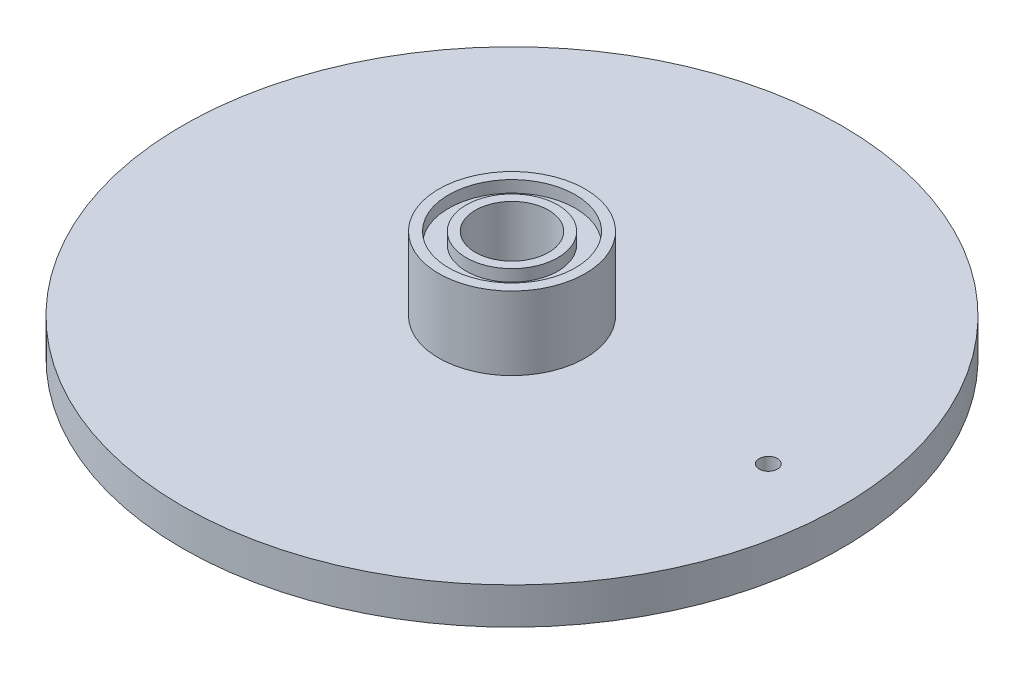
ISO-10303-21;
HEADER;
FILE_DESCRIPTION(('STEP AP214'),'2;1');
FILE_NAME('part.step','',(''),(''),'','','');
FILE_SCHEMA(('AUTOMOTIVE_DESIGN { 1 0 10303 214 1 1 1 1 }'));
ENDSEC;
DATA;
#1=APPLICATION_CONTEXT('core data for automotive mechanical design processes');
#2=APPLICATION_PROTOCOL_DEFINITION('international standard','automotive_design',2000,#1);
#3=PRODUCT_CONTEXT('',#1,'mechanical');
#4=PRODUCT('Part','Part','',(#3));
#5=PRODUCT_RELATED_PRODUCT_CATEGORY('part','',(#4));
#6=PRODUCT_DEFINITION_FORMATION('','',#4);
#7=PRODUCT_DEFINITION_CONTEXT('part definition',#1,'design');
#8=PRODUCT_DEFINITION('design','',#6,#7);
#9=PRODUCT_DEFINITION_SHAPE('','',#8);
#10=(LENGTH_UNIT() NAMED_UNIT(*) SI_UNIT(.MILLI.,.METRE.));
#11=(NAMED_UNIT(*) PLANE_ANGLE_UNIT() SI_UNIT($,.RADIAN.));
#12=(NAMED_UNIT(*) SI_UNIT($,.STERADIAN.) SOLID_ANGLE_UNIT());
#13=UNCERTAINTY_MEASURE_WITH_UNIT(LENGTH_MEASURE(1.E-05),#10,'distance_accuracy_value','');
#14=(GEOMETRIC_REPRESENTATION_CONTEXT(3) GLOBAL_UNCERTAINTY_ASSIGNED_CONTEXT((#13)) GLOBAL_UNIT_ASSIGNED_CONTEXT((#10,
#11,#12)) REPRESENTATION_CONTEXT('',''));
#15=CARTESIAN_POINT('',(0.,0.,0.));
#16=DIRECTION('',(0.,0.,1.));
#17=DIRECTION('',(1.,0.,0.));
#18=AXIS2_PLACEMENT_3D('',#15,#16,#17);
#19=CARTESIAN_POINT('',(0.,0.,0.));
#20=DIRECTION('',(0.,-1.,0.));
#21=DIRECTION('',(0.,0.,-1.));
#22=AXIS2_PLACEMENT_3D('',#19,#20,#21);
#23=CYLINDRICAL_SURFACE('',#22,6.35);
#24=CARTESIAN_POINT('',(0.,6.35,0.));
#25=DIRECTION('',(0.,-1.,0.));
#26=DIRECTION('',(0.,0.,-1.));
#27=AXIS2_PLACEMENT_3D('',#24,#25,#26);
#28=CIRCLE('',#27,6.35);
#29=CARTESIAN_POINT('',(0.,6.35,-6.35));
#30=VERTEX_POINT('',#29);
#31=EDGE_CURVE('E11',#30,#30,#28,.T.);
#32=ORIENTED_EDGE('',*,*,#31,.F.);
#33=EDGE_LOOP('',(#32));
#34=FACE_BOUND('',#33,.T.);
#35=CARTESIAN_POINT('',(0.,0.,0.));
#36=DIRECTION('',(0.,-1.,0.));
#37=DIRECTION('',(0.,0.,-1.));
#38=AXIS2_PLACEMENT_3D('',#35,#36,#37);
#39=CIRCLE('',#38,6.35);
#40=CARTESIAN_POINT('',(0.,0.,-6.35));
#41=VERTEX_POINT('',#40);
#42=EDGE_CURVE('E59',#41,#41,#39,.T.);
#43=ORIENTED_EDGE('',*,*,#42,.T.);
#44=EDGE_LOOP('',(#43));
#45=FACE_BOUND('',#44,.T.);
#46=ADVANCED_FACE('F38',(#34,#45),#23,.F.);
#47=CARTESIAN_POINT('',(-6.35,6.35,0.));
#48=DIRECTION('',(0.,-1.,0.));
#49=DIRECTION('',(0.,0.,-1.));
#50=AXIS2_PLACEMENT_3D('',#47,#48,#49);
#51=PLANE('',#50);
#52=CARTESIAN_POINT('',(0.,6.35,0.));
#53=DIRECTION('',(0.,-1.,0.));
#54=DIRECTION('',(0.,0.,-1.));
#55=AXIS2_PLACEMENT_3D('',#52,#53,#54);
#56=CIRCLE('',#55,8.382);
#57=CARTESIAN_POINT('',(0.,6.35,-8.382));
#58=VERTEX_POINT('',#57);
#59=EDGE_CURVE('E45',#58,#58,#56,.T.);
#60=ORIENTED_EDGE('',*,*,#59,.F.);
#61=EDGE_LOOP('',(#60));
#62=FACE_BOUND('',#61,.T.);
#63=ORIENTED_EDGE('',*,*,#31,.T.);
#64=EDGE_LOOP('',(#63));
#65=FACE_BOUND('',#64,.T.);
#66=ADVANCED_FACE('F134',(#62,#65),#51,.F.);
#67=CARTESIAN_POINT('',(0.,0.,0.));
#68=DIRECTION('',(0.,-1.,0.));
#69=DIRECTION('',(0.,0.,-1.));
#70=AXIS2_PLACEMENT_3D('',#67,#68,#69);
#71=CYLINDRICAL_SURFACE('',#70,8.382);
#72=CARTESIAN_POINT('',(0.,9.398,0.));
#73=DIRECTION('',(0.,-1.,0.));
#74=DIRECTION('',(0.,0.,-1.));
#75=AXIS2_PLACEMENT_3D('',#72,#73,#74);
#76=CIRCLE('',#75,8.382);
#77=CARTESIAN_POINT('',(0.,9.398,-8.382));
#78=VERTEX_POINT('',#77);
#79=EDGE_CURVE('E125',#78,#78,#76,.T.);
#80=ORIENTED_EDGE('',*,*,#79,.F.);
#81=EDGE_LOOP('',(#80));
#82=FACE_BOUND('',#81,.T.);
#83=ORIENTED_EDGE('',*,*,#59,.T.);
#84=EDGE_LOOP('',(#83));
#85=FACE_BOUND('',#84,.T.);
#86=ADVANCED_FACE('F132',(#82,#85),#71,.F.);
#87=CARTESIAN_POINT('',(-8.382,9.398,0.));
#88=DIRECTION('',(0.,1.,0.));
#89=DIRECTION('',(0.,0.,1.));
#90=AXIS2_PLACEMENT_3D('',#87,#88,#89);
#91=PLANE('',#90);
#92=CARTESIAN_POINT('',(0.,9.398,0.));
#93=DIRECTION('',(0.,-1.,0.));
#94=DIRECTION('',(0.,0.,-1.));
#95=AXIS2_PLACEMENT_3D('',#92,#93,#94);
#96=CIRCLE('',#95,6.35);
#97=CARTESIAN_POINT('',(0.,9.398,-6.35));
#98=VERTEX_POINT('',#97);
#99=EDGE_CURVE('E121',#98,#98,#96,.T.);
#100=ORIENTED_EDGE('',*,*,#99,.F.);
#101=EDGE_LOOP('',(#100));
#102=FACE_BOUND('',#101,.T.);
#103=ORIENTED_EDGE('',*,*,#79,.T.);
#104=EDGE_LOOP('',(#103));
#105=FACE_BOUND('',#104,.T.);
#106=ADVANCED_FACE('F224',(#102,#105),#91,.F.);
#107=CARTESIAN_POINT('',(0.,0.,0.));
#108=DIRECTION('',(0.,-1.,0.));
#109=DIRECTION('',(0.,0.,-1.));
#110=AXIS2_PLACEMENT_3D('',#107,#108,#109);
#111=CYLINDRICAL_SURFACE('',#110,6.35);
#112=CARTESIAN_POINT('',(0.,19.05,0.));
#113=DIRECTION('',(0.,-1.,0.));
#114=DIRECTION('',(0.,0.,-1.));
#115=AXIS2_PLACEMENT_3D('',#112,#113,#114);
#116=CIRCLE('',#115,6.35);
#117=CARTESIAN_POINT('',(0.,19.05,-6.35));
#118=VERTEX_POINT('',#117);
#119=EDGE_CURVE('E117',#118,#118,#116,.T.);
#120=ORIENTED_EDGE('',*,*,#119,.F.);
#121=EDGE_LOOP('',(#120));
#122=FACE_BOUND('',#121,.T.);
#123=ORIENTED_EDGE('',*,*,#99,.T.);
#124=EDGE_LOOP('',(#123));
#125=FACE_BOUND('',#124,.T.);
#126=ADVANCED_FACE('F218',(#122,#125),#111,.F.);
#127=CARTESIAN_POINT('',(-7.9375,19.05,0.));
#128=DIRECTION('',(0.,-1.,0.));
#129=DIRECTION('',(0.,0.,-1.));
#130=AXIS2_PLACEMENT_3D('',#127,#128,#129);
#131=PLANE('',#130);
#132=CARTESIAN_POINT('',(0.,19.05,0.));
#133=DIRECTION('',(0.,-1.,0.));
#134=DIRECTION('',(0.,0.,-1.));
#135=AXIS2_PLACEMENT_3D('',#132,#133,#134);
#136=CIRCLE('',#135,7.9375);
#137=CARTESIAN_POINT('',(0.,19.05,-7.9375));
#138=VERTEX_POINT('',#137);
#139=EDGE_CURVE('E113',#138,#138,#136,.T.);
#140=ORIENTED_EDGE('',*,*,#139,.F.);
#141=EDGE_LOOP('',(#140));
#142=FACE_BOUND('',#141,.T.);
#143=ORIENTED_EDGE('',*,*,#119,.T.);
#144=EDGE_LOOP('',(#143));
#145=FACE_BOUND('',#144,.T.);
#146=ADVANCED_FACE('F212',(#142,#145),#131,.F.);
#147=CARTESIAN_POINT('',(0.,0.,0.));
#148=DIRECTION('',(0.,-1.,0.));
#149=DIRECTION('',(0.,0.,-1.));
#150=AXIS2_PLACEMENT_3D('',#147,#148,#149);
#151=CYLINDRICAL_SURFACE('',#150,7.9375);
#152=CARTESIAN_POINT('',(0.,17.018,0.));
#153=DIRECTION('',(0.,-1.,0.));
#154=DIRECTION('',(0.,0.,-1.));
#155=AXIS2_PLACEMENT_3D('',#152,#153,#154);
#156=CIRCLE('',#155,7.9375);
#157=CARTESIAN_POINT('',(0.,17.018,-7.9375));
#158=VERTEX_POINT('',#157);
#159=EDGE_CURVE('E109',#158,#158,#156,.T.);
#160=ORIENTED_EDGE('',*,*,#159,.F.);
#161=EDGE_LOOP('',(#160));
#162=FACE_BOUND('',#161,.T.);
#163=ORIENTED_EDGE('',*,*,#139,.T.);
#164=EDGE_LOOP('',(#163));
#165=FACE_BOUND('',#164,.T.);
#166=ADVANCED_FACE('F206',(#162,#165),#151,.T.);
#167=CARTESIAN_POINT('',(-10.9855,17.018,0.));
#168=DIRECTION('',(0.,-1.,0.));
#169=DIRECTION('',(0.,0.,-1.));
#170=AXIS2_PLACEMENT_3D('',#167,#168,#169);
#171=PLANE('',#170);
#172=CARTESIAN_POINT('',(0.,17.018,0.));
#173=DIRECTION('',(0.,-1.,0.));
#174=DIRECTION('',(0.,0.,-1.));
#175=AXIS2_PLACEMENT_3D('',#172,#173,#174);
#176=CIRCLE('',#175,10.9855);
#177=CARTESIAN_POINT('',(0.,17.018,-10.9855));
#178=VERTEX_POINT('',#177);
#179=EDGE_CURVE('E105',#178,#178,#176,.T.);
#180=ORIENTED_EDGE('',*,*,#179,.F.);
#181=EDGE_LOOP('',(#180));
#182=FACE_BOUND('',#181,.T.);
#183=ORIENTED_EDGE('',*,*,#159,.T.);
#184=EDGE_LOOP('',(#183));
#185=FACE_BOUND('',#184,.T.);
#186=ADVANCED_FACE('F200',(#182,#185),#171,.F.);
#187=CARTESIAN_POINT('',(0.,0.,0.));
#188=DIRECTION('',(0.,-1.,0.));
#189=DIRECTION('',(0.,0.,-1.));
#190=AXIS2_PLACEMENT_3D('',#187,#188,#189);
#191=CYLINDRICAL_SURFACE('',#190,10.9855);
#192=CARTESIAN_POINT('',(0.,19.05,0.));
#193=DIRECTION('',(0.,-1.,0.));
#194=DIRECTION('',(0.,0.,-1.));
#195=AXIS2_PLACEMENT_3D('',#192,#193,#194);
#196=CIRCLE('',#195,10.9855);
#197=CARTESIAN_POINT('',(0.,19.05,-10.9855));
#198=VERTEX_POINT('',#197);
#199=EDGE_CURVE('E101',#198,#198,#196,.T.);
#200=ORIENTED_EDGE('',*,*,#199,.F.);
#201=EDGE_LOOP('',(#200));
#202=FACE_BOUND('',#201,.T.);
#203=ORIENTED_EDGE('',*,*,#179,.T.);
#204=EDGE_LOOP('',(#203));
#205=FACE_BOUND('',#204,.T.);
#206=ADVANCED_FACE('F194',(#202,#205),#191,.F.);
#207=CARTESIAN_POINT('',(-12.7,19.05,0.));
#208=DIRECTION('',(0.,-1.,0.));
#209=DIRECTION('',(0.,0.,-1.));
#210=AXIS2_PLACEMENT_3D('',#207,#208,#209);
#211=PLANE('',#210);
#212=CARTESIAN_POINT('',(0.,19.05,0.));
#213=DIRECTION('',(0.,-1.,0.));
#214=DIRECTION('',(0.,0.,-1.));
#215=AXIS2_PLACEMENT_3D('',#212,#213,#214);
#216=CIRCLE('',#215,12.7);
#217=CARTESIAN_POINT('',(0.,19.05,-12.7));
#218=VERTEX_POINT('',#217);
#219=EDGE_CURVE('E97',#218,#218,#216,.T.);
#220=ORIENTED_EDGE('',*,*,#219,.F.);
#221=EDGE_LOOP('',(#220));
#222=FACE_BOUND('',#221,.T.);
#223=ORIENTED_EDGE('',*,*,#199,.T.);
#224=EDGE_LOOP('',(#223));
#225=FACE_BOUND('',#224,.T.);
#226=ADVANCED_FACE('F188',(#222,#225),#211,.F.);
#227=CARTESIAN_POINT('',(0.,0.,0.));
#228=DIRECTION('',(0.,-1.,0.));
#229=DIRECTION('',(0.,0.,-1.));
#230=AXIS2_PLACEMENT_3D('',#227,#228,#229);
#231=CYLINDRICAL_SURFACE('',#230,12.7);
#232=CARTESIAN_POINT('',(0.,6.34999999999999,0.));
#233=DIRECTION('',(0.,-1.,0.));
#234=DIRECTION('',(0.,0.,-1.));
#235=AXIS2_PLACEMENT_3D('',#232,#233,#234);
#236=CIRCLE('',#235,12.7);
#237=CARTESIAN_POINT('',(0.,6.34999999999999,-12.7));
#238=VERTEX_POINT('',#237);
#239=EDGE_CURVE('E93',#238,#238,#236,.T.);
#240=ORIENTED_EDGE('',*,*,#239,.F.);
#241=EDGE_LOOP('',(#240));
#242=FACE_BOUND('',#241,.T.);
#243=ORIENTED_EDGE('',*,*,#219,.T.);
#244=EDGE_LOOP('',(#243));
#245=FACE_BOUND('',#244,.T.);
#246=ADVANCED_FACE('F181',(#242,#245),#231,.T.);
#247=CARTESIAN_POINT('',(-57.15,6.34999999999999,0.));
#248=DIRECTION('',(0.,-1.,0.));
#249=DIRECTION('',(0.,0.,-1.));
#250=AXIS2_PLACEMENT_3D('',#247,#248,#249);
#251=PLANE('',#250);
#252=CARTESIAN_POINT('',(44.45,6.35,0.));
#253=DIRECTION('',(0.,1.,0.));
#254=DIRECTION('',(0.,0.,1.));
#255=AXIS2_PLACEMENT_3D('',#252,#253,#254);
#256=CIRCLE('',#255,1.58749999999999);
#257=CARTESIAN_POINT('',(44.45,6.35,1.58749999999999));
#258=VERTEX_POINT('',#257);
#259=EDGE_CURVE('E60',#258,#258,#256,.T.);
#260=ORIENTED_EDGE('',*,*,#259,.F.);
#261=EDGE_LOOP('',(#260));
#262=FACE_BOUND('',#261,.T.);
#263=CARTESIAN_POINT('',(0.,6.34999999999999,0.));
#264=DIRECTION('',(0.,-1.,0.));
#265=DIRECTION('',(0.,0.,-1.));
#266=AXIS2_PLACEMENT_3D('',#263,#264,#265);
#267=CIRCLE('',#266,57.15);
#268=CARTESIAN_POINT('',(0.,6.34999999999999,-57.15));
#269=VERTEX_POINT('',#268);
#270=EDGE_CURVE('E89',#269,#269,#267,.T.);
#271=ORIENTED_EDGE('',*,*,#270,.F.);
#272=EDGE_LOOP('',(#271));
#273=FACE_BOUND('',#272,.T.);
#274=ORIENTED_EDGE('',*,*,#239,.T.);
#275=EDGE_LOOP('',(#274));
#276=FACE_BOUND('',#275,.T.);
#277=ADVANCED_FACE('F175',(#262,#273,#276),#251,.F.);
#278=CARTESIAN_POINT('',(0.,0.,0.));
#279=DIRECTION('',(0.,-1.,0.));
#280=DIRECTION('',(0.,0.,-1.));
#281=AXIS2_PLACEMENT_3D('',#278,#279,#280);
#282=CYLINDRICAL_SURFACE('',#281,57.15);
#283=CARTESIAN_POINT('',(0.,0.,0.));
#284=DIRECTION('',(0.,-1.,0.));
#285=DIRECTION('',(0.,0.,-1.));
#286=AXIS2_PLACEMENT_3D('',#283,#284,#285);
#287=CIRCLE('',#286,57.15);
#288=CARTESIAN_POINT('',(0.,0.,-57.15));
#289=VERTEX_POINT('',#288);
#290=EDGE_CURVE('E85',#289,#289,#287,.T.);
#291=ORIENTED_EDGE('',*,*,#290,.F.);
#292=EDGE_LOOP('',(#291));
#293=FACE_BOUND('',#292,.T.);
#294=ORIENTED_EDGE('',*,*,#270,.T.);
#295=EDGE_LOOP('',(#294));
#296=FACE_BOUND('',#295,.T.);
#297=ADVANCED_FACE('F169',(#293,#296),#282,.T.);
#298=CARTESIAN_POINT('',(-57.15,0.,0.));
#299=DIRECTION('',(0.,1.,0.));
#300=DIRECTION('',(0.,0.,1.));
#301=AXIS2_PLACEMENT_3D('',#298,#299,#300);
#302=PLANE('',#301);
#303=CARTESIAN_POINT('',(0.,0.,0.));
#304=DIRECTION('',(0.,-1.,0.));
#305=DIRECTION('',(0.,0.,-1.));
#306=AXIS2_PLACEMENT_3D('',#303,#304,#305);
#307=CIRCLE('',#306,55.5625);
#308=CARTESIAN_POINT('',(0.,0.,-55.5625));
#309=VERTEX_POINT('',#308);
#310=EDGE_CURVE('E81',#309,#309,#307,.T.);
#311=ORIENTED_EDGE('',*,*,#310,.F.);
#312=EDGE_LOOP('',(#311));
#313=FACE_BOUND('',#312,.T.);
#314=ORIENTED_EDGE('',*,*,#290,.T.);
#315=EDGE_LOOP('',(#314));
#316=FACE_BOUND('',#315,.T.);
#317=ADVANCED_FACE('F163',(#313,#316),#302,.F.);
#318=CARTESIAN_POINT('',(0.,0.,0.));
#319=DIRECTION('',(0.,-1.,0.));
#320=DIRECTION('',(0.,0.,-1.));
#321=AXIS2_PLACEMENT_3D('',#318,#319,#320);
#322=CYLINDRICAL_SURFACE('',#321,55.5625);
#323=CARTESIAN_POINT('',(0.,2.03199999999999,0.));
#324=DIRECTION('',(0.,-1.,0.));
#325=DIRECTION('',(0.,0.,-1.));
#326=AXIS2_PLACEMENT_3D('',#323,#324,#325);
#327=CIRCLE('',#326,55.5625);
#328=CARTESIAN_POINT('',(0.,2.03199999999999,-55.5625));
#329=VERTEX_POINT('',#328);
#330=EDGE_CURVE('E77',#329,#329,#327,.T.);
#331=ORIENTED_EDGE('',*,*,#330,.F.);
#332=EDGE_LOOP('',(#331));
#333=FACE_BOUND('',#332,.T.);
#334=ORIENTED_EDGE('',*,*,#310,.T.);
#335=EDGE_LOOP('',(#334));
#336=FACE_BOUND('',#335,.T.);
#337=ADVANCED_FACE('F157',(#333,#336),#322,.F.);
#338=CARTESIAN_POINT('',(-55.5625,2.03199999999999,0.));
#339=DIRECTION('',(0.,1.,0.));
#340=DIRECTION('',(0.,0.,1.));
#341=AXIS2_PLACEMENT_3D('',#338,#339,#340);
#342=PLANE('',#341);
#343=CARTESIAN_POINT('',(0.,2.03199999999999,0.));
#344=DIRECTION('',(0.,-1.,0.));
#345=DIRECTION('',(0.,0.,-1.));
#346=AXIS2_PLACEMENT_3D('',#343,#344,#345);
#347=CIRCLE('',#346,52.5145);
#348=CARTESIAN_POINT('',(0.,2.03199999999999,-52.5145));
#349=VERTEX_POINT('',#348);
#350=EDGE_CURVE('E73',#349,#349,#347,.T.);
#351=ORIENTED_EDGE('',*,*,#350,.F.);
#352=EDGE_LOOP('',(#351));
#353=FACE_BOUND('',#352,.T.);
#354=ORIENTED_EDGE('',*,*,#330,.T.);
#355=EDGE_LOOP('',(#354));
#356=FACE_BOUND('',#355,.T.);
#357=ADVANCED_FACE('F151',(#353,#356),#342,.F.);
#358=CARTESIAN_POINT('',(0.,0.,0.));
#359=DIRECTION('',(0.,-1.,0.));
#360=DIRECTION('',(0.,0.,-1.));
#361=AXIS2_PLACEMENT_3D('',#358,#359,#360);
#362=CYLINDRICAL_SURFACE('',#361,52.5145);
#363=CARTESIAN_POINT('',(0.,0.,0.));
#364=DIRECTION('',(0.,-1.,0.));
#365=DIRECTION('',(0.,0.,-1.));
#366=AXIS2_PLACEMENT_3D('',#363,#364,#365);
#367=CIRCLE('',#366,52.5145);
#368=CARTESIAN_POINT('',(0.,0.,-52.5145));
#369=VERTEX_POINT('',#368);
#370=EDGE_CURVE('E65',#369,#369,#367,.T.);
#371=ORIENTED_EDGE('',*,*,#370,.F.);
#372=EDGE_LOOP('',(#371));
#373=FACE_BOUND('',#372,.T.);
#374=ORIENTED_EDGE('',*,*,#350,.T.);
#375=EDGE_LOOP('',(#374));
#376=FACE_BOUND('',#375,.T.);
#377=ADVANCED_FACE('F145',(#373,#376),#362,.T.);
#378=CARTESIAN_POINT('',(-6.35,0.,0.));
#379=DIRECTION('',(0.,1.,0.));
#380=DIRECTION('',(0.,0.,1.));
#381=AXIS2_PLACEMENT_3D('',#378,#379,#380);
#382=PLANE('',#381);
#383=ORIENTED_EDGE('',*,*,#42,.F.);
#384=EDGE_LOOP('',(#383));
#385=FACE_BOUND('',#384,.T.);
#386=ORIENTED_EDGE('',*,*,#370,.T.);
#387=EDGE_LOOP('',(#386));
#388=FACE_BOUND('',#387,.T.);
#389=ADVANCED_FACE('F52',(#385,#388),#382,.F.);
#390=CARTESIAN_POINT('',(44.45,3.17499999999999,0.));
#391=DIRECTION('',(0.,1.,0.));
#392=DIRECTION('',(0.,0.,1.));
#393=AXIS2_PLACEMENT_3D('',#390,#391,#392);
#394=CONICAL_SURFACE('',#393,1.5875,1.02974425867665);
#395=CARTESIAN_POINT('',(44.45,2.22113376729374,0.));
#396=VERTEX_POINT('',#395);
#397=VERTEX_LOOP('',#396);
#398=FACE_BOUND('',#397,.T.);
#399=CARTESIAN_POINT('',(44.45,3.17499999999999,0.));
#400=DIRECTION('',(0.,1.,0.));
#401=DIRECTION('',(0.,0.,1.));
#402=AXIS2_PLACEMENT_3D('',#399,#400,#401);
#403=CIRCLE('',#402,1.5875);
#404=CARTESIAN_POINT('',(44.45,3.17499999999999,1.5875));
#405=VERTEX_POINT('',#404);
#406=EDGE_CURVE('E56',#405,#405,#403,.T.);
#407=ORIENTED_EDGE('',*,*,#406,.T.);
#408=EDGE_LOOP('',(#407));
#409=FACE_BOUND('',#408,.T.);
#410=ADVANCED_FACE('F48',(#398,#409),#394,.F.);
#411=CARTESIAN_POINT('',(44.45,6.34999999999999,0.));
#412=DIRECTION('',(0.,1.,0.));
#413=DIRECTION('',(0.,0.,1.));
#414=AXIS2_PLACEMENT_3D('',#411,#412,#413);
#415=CYLINDRICAL_SURFACE('',#414,1.5875);
#416=ORIENTED_EDGE('',*,*,#406,.F.);
#417=EDGE_LOOP('',(#416));
#418=FACE_BOUND('',#417,.T.);
#419=ORIENTED_EDGE('',*,*,#259,.T.);
#420=EDGE_LOOP('',(#419));
#421=FACE_BOUND('',#420,.T.);
#422=ADVANCED_FACE('F51',(#418,#421),#415,.F.);
#423=CLOSED_SHELL('',(#46,#66,#86,#106,#126,#146,#166,#186,#206,#226,#246,#277,#297,#317,#337,
#357,#377,#389,#410,#422));
#424=MANIFOLD_SOLID_BREP('B2',#423);
#425=ADVANCED_BREP_SHAPE_REPRESENTATION('',(#18,#424),#14);
#426=SHAPE_DEFINITION_REPRESENTATION(#9,#425);
ENDSEC;
END-ISO-10303-21;
